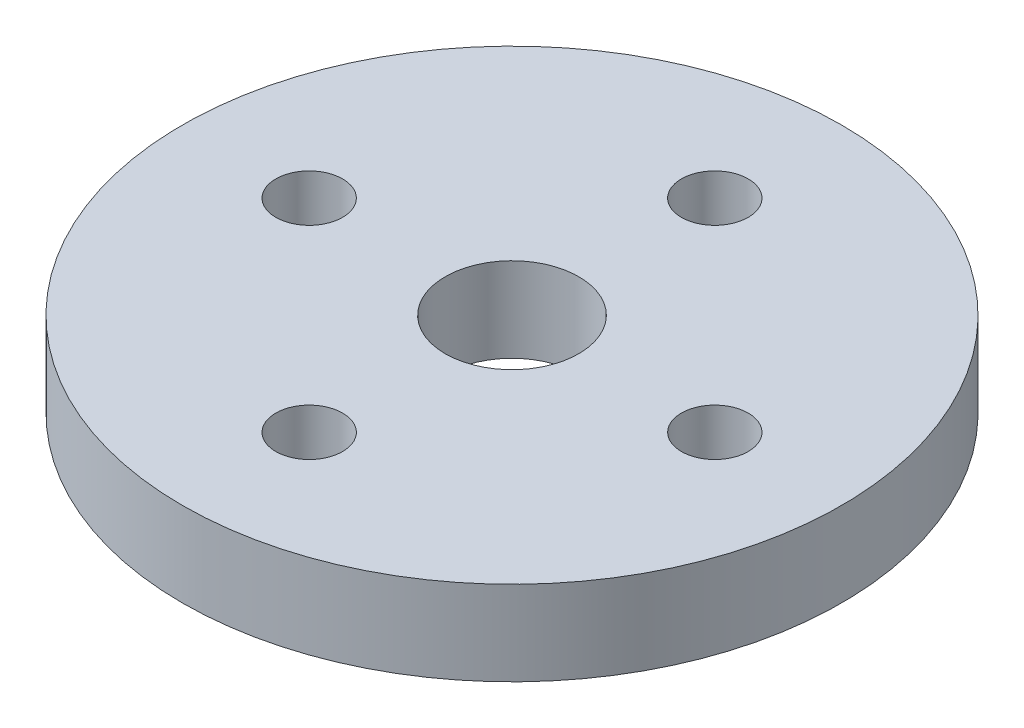
ISO-10303-21;
HEADER;
FILE_DESCRIPTION(('STEP AP214'),'2;1');
FILE_NAME('part.step','',(''),(''),'','','');
FILE_SCHEMA(('AUTOMOTIVE_DESIGN { 1 0 10303 214 1 1 1 1 }'));
ENDSEC;
DATA;
#1=APPLICATION_CONTEXT('core data for automotive mechanical design processes');
#2=APPLICATION_PROTOCOL_DEFINITION('international standard','automotive_design',2000,#1);
#3=PRODUCT_CONTEXT('',#1,'mechanical');
#4=PRODUCT('Part','Part','',(#3));
#5=PRODUCT_RELATED_PRODUCT_CATEGORY('part','',(#4));
#6=PRODUCT_DEFINITION_FORMATION('','',#4);
#7=PRODUCT_DEFINITION_CONTEXT('part definition',#1,'design');
#8=PRODUCT_DEFINITION('design','',#6,#7);
#9=PRODUCT_DEFINITION_SHAPE('','',#8);
#10=(LENGTH_UNIT() NAMED_UNIT(*) SI_UNIT(.MILLI.,.METRE.));
#11=(NAMED_UNIT(*) PLANE_ANGLE_UNIT() SI_UNIT($,.RADIAN.));
#12=(NAMED_UNIT(*) SI_UNIT($,.STERADIAN.) SOLID_ANGLE_UNIT());
#13=UNCERTAINTY_MEASURE_WITH_UNIT(LENGTH_MEASURE(1.E-05),#10,'distance_accuracy_value','');
#14=(GEOMETRIC_REPRESENTATION_CONTEXT(3) GLOBAL_UNCERTAINTY_ASSIGNED_CONTEXT((#13)) GLOBAL_UNIT_ASSIGNED_CONTEXT((#10,
#11,#12)) REPRESENTATION_CONTEXT('',''));
#15=CARTESIAN_POINT('',(0.,0.,0.));
#16=DIRECTION('',(0.,0.,1.));
#17=DIRECTION('',(1.,0.,0.));
#18=AXIS2_PLACEMENT_3D('',#15,#16,#17);
#19=CARTESIAN_POINT('',(0.,5.,0.));
#20=DIRECTION('',(0.,1.,0.));
#21=DIRECTION('',(0.,0.,1.));
#22=AXIS2_PLACEMENT_3D('',#19,#20,#21);
#23=PLANE('',#22);
#24=CARTESIAN_POINT('',(12.,5.,0.));
#25=DIRECTION('',(0.,1.,0.));
#26=DIRECTION('',(0.,0.,-1.));
#27=AXIS2_PLACEMENT_3D('',#24,#25,#26);
#28=CIRCLE('',#27,1.975);
#29=CARTESIAN_POINT('',(12.,5.,-1.975));
#30=VERTEX_POINT('',#29);
#31=EDGE_CURVE('E64',#30,#30,#28,.T.);
#32=ORIENTED_EDGE('',*,*,#31,.F.);
#33=EDGE_LOOP('',(#32));
#34=FACE_BOUND('',#33,.T.);
#35=CARTESIAN_POINT('',(0.,5.,-12.));
#36=DIRECTION('',(0.,1.,0.));
#37=DIRECTION('',(0.,0.,1.));
#38=AXIS2_PLACEMENT_3D('',#35,#36,#37);
#39=CIRCLE('',#38,1.975);
#40=CARTESIAN_POINT('',(0.,5.,-10.025));
#41=VERTEX_POINT('',#40);
#42=EDGE_CURVE('E52',#41,#41,#39,.T.);
#43=ORIENTED_EDGE('',*,*,#42,.F.);
#44=EDGE_LOOP('',(#43));
#45=FACE_BOUND('',#44,.T.);
#46=CARTESIAN_POINT('',(0.,5.,0.));
#47=DIRECTION('',(0.,1.,0.));
#48=DIRECTION('',(0.,0.,1.));
#49=AXIS2_PLACEMENT_3D('',#46,#47,#48);
#50=CIRCLE('',#49,19.5);
#51=CARTESIAN_POINT('',(0.,5.,19.5));
#52=VERTEX_POINT('',#51);
#53=EDGE_CURVE('E10',#52,#52,#50,.T.);
#54=ORIENTED_EDGE('',*,*,#53,.T.);
#55=EDGE_LOOP('',(#54));
#56=FACE_BOUND('',#55,.T.);
#57=CARTESIAN_POINT('',(0.,5.,0.));
#58=DIRECTION('',(0.,1.,0.));
#59=DIRECTION('',(0.,0.,1.));
#60=AXIS2_PLACEMENT_3D('',#57,#58,#59);
#61=CIRCLE('',#60,3.95);
#62=CARTESIAN_POINT('',(0.,5.,3.95));
#63=VERTEX_POINT('',#62);
#64=EDGE_CURVE('E47',#63,#63,#61,.T.);
#65=ORIENTED_EDGE('',*,*,#64,.F.);
#66=EDGE_LOOP('',(#65));
#67=FACE_BOUND('',#66,.T.);
#68=CARTESIAN_POINT('',(-12.,5.,0.));
#69=DIRECTION('',(0.,1.,0.));
#70=DIRECTION('',(0.,0.,1.));
#71=AXIS2_PLACEMENT_3D('',#68,#69,#70);
#72=CIRCLE('',#71,1.975);
#73=CARTESIAN_POINT('',(-12.,5.,1.975));
#74=VERTEX_POINT('',#73);
#75=EDGE_CURVE('E58',#74,#74,#72,.T.);
#76=ORIENTED_EDGE('',*,*,#75,.F.);
#77=EDGE_LOOP('',(#76));
#78=FACE_BOUND('',#77,.T.);
#79=CARTESIAN_POINT('',(0.,5.,12.));
#80=DIRECTION('',(0.,1.,0.));
#81=DIRECTION('',(0.,0.,-1.));
#82=AXIS2_PLACEMENT_3D('',#79,#80,#81);
#83=CIRCLE('',#82,1.975);
#84=CARTESIAN_POINT('',(0.,5.,10.025));
#85=VERTEX_POINT('',#84);
#86=EDGE_CURVE('E70',#85,#85,#83,.T.);
#87=ORIENTED_EDGE('',*,*,#86,.F.);
#88=EDGE_LOOP('',(#87));
#89=FACE_BOUND('',#88,.T.);
#90=ADVANCED_FACE('F36',(#34,#45,#56,#67,#78,#89),#23,.T.);
#91=CARTESIAN_POINT('',(0.,0.,0.));
#92=DIRECTION('',(0.,1.,0.));
#93=DIRECTION('',(0.,0.,1.));
#94=AXIS2_PLACEMENT_3D('',#91,#92,#93);
#95=PLANE('',#94);
#96=CARTESIAN_POINT('',(0.,0.,0.));
#97=DIRECTION('',(0.,1.,0.));
#98=DIRECTION('',(0.,0.,1.));
#99=AXIS2_PLACEMENT_3D('',#96,#97,#98);
#100=CIRCLE('',#99,19.5);
#101=CARTESIAN_POINT('',(0.,0.,19.5));
#102=VERTEX_POINT('',#101);
#103=EDGE_CURVE('E40',#102,#102,#100,.T.);
#104=ORIENTED_EDGE('',*,*,#103,.F.);
#105=EDGE_LOOP('',(#104));
#106=FACE_BOUND('',#105,.T.);
#107=CARTESIAN_POINT('',(0.,0.,0.));
#108=DIRECTION('',(0.,1.,0.));
#109=DIRECTION('',(0.,0.,1.));
#110=AXIS2_PLACEMENT_3D('',#107,#108,#109);
#111=CIRCLE('',#110,3.95);
#112=CARTESIAN_POINT('',(0.,0.,3.95));
#113=VERTEX_POINT('',#112);
#114=EDGE_CURVE('E49',#113,#113,#111,.T.);
#115=ORIENTED_EDGE('',*,*,#114,.T.);
#116=EDGE_LOOP('',(#115));
#117=FACE_BOUND('',#116,.T.);
#118=CARTESIAN_POINT('',(0.,0.,-12.));
#119=DIRECTION('',(0.,1.,0.));
#120=DIRECTION('',(0.,0.,1.));
#121=AXIS2_PLACEMENT_3D('',#118,#119,#120);
#122=CIRCLE('',#121,1.975);
#123=CARTESIAN_POINT('',(0.,0.,-10.025));
#124=VERTEX_POINT('',#123);
#125=EDGE_CURVE('E55',#124,#124,#122,.T.);
#126=ORIENTED_EDGE('',*,*,#125,.T.);
#127=EDGE_LOOP('',(#126));
#128=FACE_BOUND('',#127,.T.);
#129=CARTESIAN_POINT('',(-12.,0.,0.));
#130=DIRECTION('',(0.,1.,0.));
#131=DIRECTION('',(0.,0.,1.));
#132=AXIS2_PLACEMENT_3D('',#129,#130,#131);
#133=CIRCLE('',#132,1.975);
#134=CARTESIAN_POINT('',(-12.,0.,1.975));
#135=VERTEX_POINT('',#134);
#136=EDGE_CURVE('E61',#135,#135,#133,.T.);
#137=ORIENTED_EDGE('',*,*,#136,.T.);
#138=EDGE_LOOP('',(#137));
#139=FACE_BOUND('',#138,.T.);
#140=CARTESIAN_POINT('',(12.,0.,0.));
#141=DIRECTION('',(0.,1.,0.));
#142=DIRECTION('',(0.,0.,-1.));
#143=AXIS2_PLACEMENT_3D('',#140,#141,#142);
#144=CIRCLE('',#143,1.975);
#145=CARTESIAN_POINT('',(12.,0.,-1.975));
#146=VERTEX_POINT('',#145);
#147=EDGE_CURVE('E67',#146,#146,#144,.T.);
#148=ORIENTED_EDGE('',*,*,#147,.T.);
#149=EDGE_LOOP('',(#148));
#150=FACE_BOUND('',#149,.T.);
#151=CARTESIAN_POINT('',(0.,0.,12.));
#152=DIRECTION('',(0.,1.,0.));
#153=DIRECTION('',(0.,0.,-1.));
#154=AXIS2_PLACEMENT_3D('',#151,#152,#153);
#155=CIRCLE('',#154,1.975);
#156=CARTESIAN_POINT('',(0.,0.,10.025));
#157=VERTEX_POINT('',#156);
#158=EDGE_CURVE('E73',#157,#157,#155,.T.);
#159=ORIENTED_EDGE('',*,*,#158,.T.);
#160=EDGE_LOOP('',(#159));
#161=FACE_BOUND('',#160,.T.);
#162=ADVANCED_FACE('F83',(#106,#117,#128,#139,#150,#161),#95,.F.);
#163=CARTESIAN_POINT('',(0.,5.,0.));
#164=DIRECTION('',(0.,-1.,0.));
#165=DIRECTION('',(0.,0.,-1.));
#166=AXIS2_PLACEMENT_3D('',#163,#164,#165);
#167=CYLINDRICAL_SURFACE('',#166,19.5);
#168=ORIENTED_EDGE('',*,*,#53,.F.);
#169=EDGE_LOOP('',(#168));
#170=FACE_BOUND('',#169,.T.);
#171=ORIENTED_EDGE('',*,*,#103,.T.);
#172=EDGE_LOOP('',(#171));
#173=FACE_BOUND('',#172,.T.);
#174=ADVANCED_FACE('F38',(#170,#173),#167,.T.);
#175=CARTESIAN_POINT('',(0.,5.,0.));
#176=DIRECTION('',(0.,-1.,0.));
#177=DIRECTION('',(0.,0.,-1.));
#178=AXIS2_PLACEMENT_3D('',#175,#176,#177);
#179=CYLINDRICAL_SURFACE('',#178,3.95);
#180=ORIENTED_EDGE('',*,*,#64,.T.);
#181=EDGE_LOOP('',(#180));
#182=FACE_BOUND('',#181,.T.);
#183=ORIENTED_EDGE('',*,*,#114,.F.);
#184=EDGE_LOOP('',(#183));
#185=FACE_BOUND('',#184,.T.);
#186=ADVANCED_FACE('F93',(#182,#185),#179,.F.);
#187=CARTESIAN_POINT('',(0.,5.,-12.));
#188=DIRECTION('',(0.,-1.,0.));
#189=DIRECTION('',(0.,0.,-1.));
#190=AXIS2_PLACEMENT_3D('',#187,#188,#189);
#191=CYLINDRICAL_SURFACE('',#190,1.975);
#192=ORIENTED_EDGE('',*,*,#42,.T.);
#193=EDGE_LOOP('',(#192));
#194=FACE_BOUND('',#193,.T.);
#195=ORIENTED_EDGE('',*,*,#125,.F.);
#196=EDGE_LOOP('',(#195));
#197=FACE_BOUND('',#196,.T.);
#198=ADVANCED_FACE('F96',(#194,#197),#191,.F.);
#199=CARTESIAN_POINT('',(-12.,5.,0.));
#200=DIRECTION('',(0.,-1.,0.));
#201=DIRECTION('',(0.,0.,-1.));
#202=AXIS2_PLACEMENT_3D('',#199,#200,#201);
#203=CYLINDRICAL_SURFACE('',#202,1.975);
#204=ORIENTED_EDGE('',*,*,#75,.T.);
#205=EDGE_LOOP('',(#204));
#206=FACE_BOUND('',#205,.T.);
#207=ORIENTED_EDGE('',*,*,#136,.F.);
#208=EDGE_LOOP('',(#207));
#209=FACE_BOUND('',#208,.T.);
#210=ADVANCED_FACE('F100',(#206,#209),#203,.F.);
#211=CARTESIAN_POINT('',(12.,5.,0.));
#212=DIRECTION('',(0.,-1.,0.));
#213=DIRECTION('',(0.,0.,-1.));
#214=AXIS2_PLACEMENT_3D('',#211,#212,#213);
#215=CYLINDRICAL_SURFACE('',#214,1.975);
#216=ORIENTED_EDGE('',*,*,#31,.T.);
#217=EDGE_LOOP('',(#216));
#218=FACE_BOUND('',#217,.T.);
#219=ORIENTED_EDGE('',*,*,#147,.F.);
#220=EDGE_LOOP('',(#219));
#221=FACE_BOUND('',#220,.T.);
#222=ADVANCED_FACE('F104',(#218,#221),#215,.F.);
#223=CARTESIAN_POINT('',(0.,5.,12.));
#224=DIRECTION('',(0.,-1.,0.));
#225=DIRECTION('',(0.,0.,-1.));
#226=AXIS2_PLACEMENT_3D('',#223,#224,#225);
#227=CYLINDRICAL_SURFACE('',#226,1.975);
#228=ORIENTED_EDGE('',*,*,#86,.T.);
#229=EDGE_LOOP('',(#228));
#230=FACE_BOUND('',#229,.T.);
#231=ORIENTED_EDGE('',*,*,#158,.F.);
#232=EDGE_LOOP('',(#231));
#233=FACE_BOUND('',#232,.T.);
#234=ADVANCED_FACE('F79',(#230,#233),#227,.F.);
#235=CLOSED_SHELL('',(#90,#162,#174,#186,#198,#210,#222,#234));
#236=MANIFOLD_SOLID_BREP('B2',#235);
#237=ADVANCED_BREP_SHAPE_REPRESENTATION('',(#18,#236),#14);
#238=SHAPE_DEFINITION_REPRESENTATION(#9,#237);
ENDSEC;
END-ISO-10303-21;
